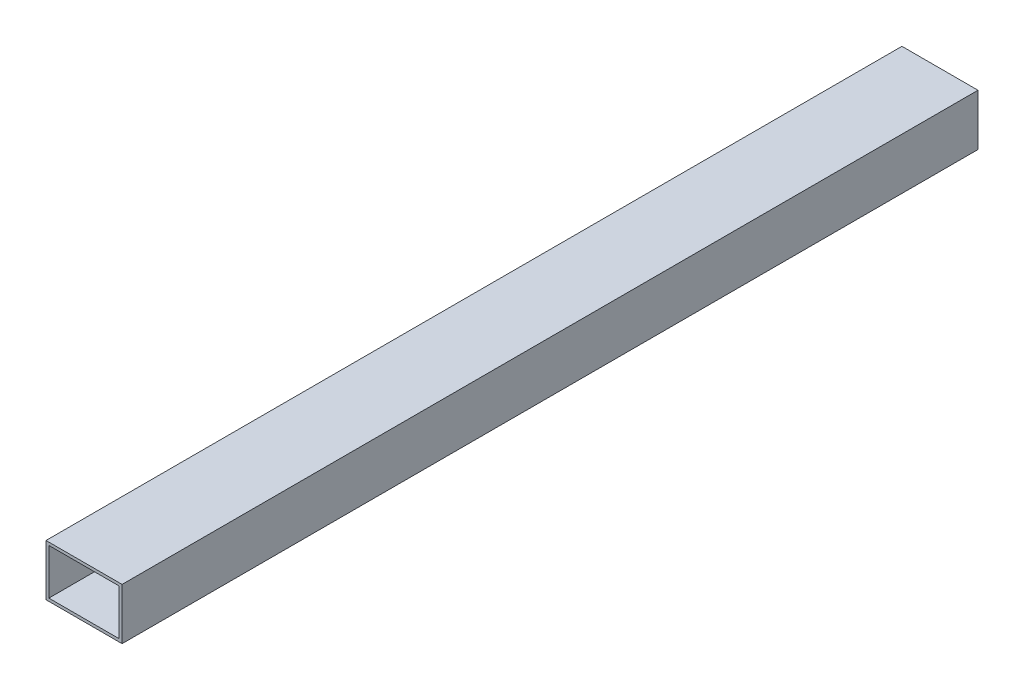
ISO-10303-21;
HEADER;
FILE_DESCRIPTION(('STEP AP214'),'2;1');
FILE_NAME('part.step','',(''),(''),'','','');
FILE_SCHEMA(('AUTOMOTIVE_DESIGN { 1 0 10303 214 1 1 1 1 }'));
ENDSEC;
DATA;
#1=APPLICATION_CONTEXT('core data for automotive mechanical design processes');
#2=APPLICATION_PROTOCOL_DEFINITION('international standard','automotive_design',2000,#1);
#3=PRODUCT_CONTEXT('',#1,'mechanical');
#4=PRODUCT('Part','Part','',(#3));
#5=PRODUCT_RELATED_PRODUCT_CATEGORY('part','',(#4));
#6=PRODUCT_DEFINITION_FORMATION('','',#4);
#7=PRODUCT_DEFINITION_CONTEXT('part definition',#1,'design');
#8=PRODUCT_DEFINITION('design','',#6,#7);
#9=PRODUCT_DEFINITION_SHAPE('','',#8);
#10=(LENGTH_UNIT() NAMED_UNIT(*) SI_UNIT(.MILLI.,.METRE.));
#11=(NAMED_UNIT(*) PLANE_ANGLE_UNIT() SI_UNIT($,.RADIAN.));
#12=(NAMED_UNIT(*) SI_UNIT($,.STERADIAN.) SOLID_ANGLE_UNIT());
#13=UNCERTAINTY_MEASURE_WITH_UNIT(LENGTH_MEASURE(1.E-05),#10,'distance_accuracy_value','');
#14=(GEOMETRIC_REPRESENTATION_CONTEXT(3) GLOBAL_UNCERTAINTY_ASSIGNED_CONTEXT((#13)) GLOBAL_UNIT_ASSIGNED_CONTEXT((#10,
#11,#12)) REPRESENTATION_CONTEXT('',''));
#15=CARTESIAN_POINT('',(0.,0.,0.));
#16=DIRECTION('',(0.,0.,1.));
#17=DIRECTION('',(1.,0.,0.));
#18=AXIS2_PLACEMENT_3D('',#15,#16,#17);
#19=CARTESIAN_POINT('',(0.,0.,450.));
#20=DIRECTION('',(0.,0.,-1.));
#21=DIRECTION('',(-1.,0.,0.));
#22=AXIS2_PLACEMENT_3D('',#19,#20,#21);
#23=PLANE('',#22);
#24=DIRECTION('',(0.,-1.,0.));
#25=VECTOR('',#24,1.);
#26=CARTESIAN_POINT('',(0.,0.,450.));
#27=LINE('',#26,#25);
#28=CARTESIAN_POINT('',(0.,27.,450.));
#29=VERTEX_POINT('',#28);
#30=CARTESIAN_POINT('',(0.,0.,450.));
#31=VERTEX_POINT('',#30);
#32=EDGE_CURVE('E134',#29,#31,#27,.T.);
#33=ORIENTED_EDGE('',*,*,#32,.T.);
#34=DIRECTION('',(1.,0.,0.));
#35=VECTOR('',#34,1.);
#36=CARTESIAN_POINT('',(0.,0.,450.));
#37=LINE('',#36,#35);
#38=CARTESIAN_POINT('',(40.,0.,450.));
#39=VERTEX_POINT('',#38);
#40=EDGE_CURVE('E137',#31,#39,#37,.T.);
#41=ORIENTED_EDGE('',*,*,#40,.T.);
#42=DIRECTION('',(0.,1.,0.));
#43=VECTOR('',#42,1.);
#44=CARTESIAN_POINT('',(40.,0.,450.));
#45=LINE('',#44,#43);
#46=CARTESIAN_POINT('',(40.,27.,450.));
#47=VERTEX_POINT('',#46);
#48=EDGE_CURVE('E140',#39,#47,#45,.T.);
#49=ORIENTED_EDGE('',*,*,#48,.T.);
#50=DIRECTION('',(-1.,0.,0.));
#51=VECTOR('',#50,1.);
#52=CARTESIAN_POINT('',(0.,27.,450.));
#53=LINE('',#52,#51);
#54=EDGE_CURVE('E142',#47,#29,#53,.T.);
#55=ORIENTED_EDGE('',*,*,#54,.T.);
#56=EDGE_LOOP('',(#33,#41,#49,#55));
#57=FACE_BOUND('',#56,.T.);
#58=DIRECTION('',(0.,-1.,0.));
#59=VECTOR('',#58,1.);
#60=CARTESIAN_POINT('',(1.5,25.5,450.));
#61=LINE('',#60,#59);
#62=CARTESIAN_POINT('',(1.5,25.5,450.));
#63=VERTEX_POINT('',#62);
#64=CARTESIAN_POINT('',(1.5,1.5,450.));
#65=VERTEX_POINT('',#64);
#66=EDGE_CURVE('E98',#63,#65,#61,.T.);
#67=ORIENTED_EDGE('',*,*,#66,.F.);
#68=DIRECTION('',(-1.,0.,0.));
#69=VECTOR('',#68,1.);
#70=CARTESIAN_POINT('',(1.5,25.5,450.));
#71=LINE('',#70,#69);
#72=CARTESIAN_POINT('',(38.5,25.5,450.));
#73=VERTEX_POINT('',#72);
#74=EDGE_CURVE('E120',#73,#63,#71,.T.);
#75=ORIENTED_EDGE('',*,*,#74,.F.);
#76=DIRECTION('',(0.,1.,0.));
#77=VECTOR('',#76,1.);
#78=CARTESIAN_POINT('',(38.5,25.5,450.));
#79=LINE('',#78,#77);
#80=CARTESIAN_POINT('',(38.5,1.5,450.));
#81=VERTEX_POINT('',#80);
#82=EDGE_CURVE('E118',#81,#73,#79,.T.);
#83=ORIENTED_EDGE('',*,*,#82,.F.);
#84=DIRECTION('',(1.,0.,0.));
#85=VECTOR('',#84,1.);
#86=CARTESIAN_POINT('',(1.5,1.5,450.));
#87=LINE('',#86,#85);
#88=EDGE_CURVE('E106',#65,#81,#87,.T.);
#89=ORIENTED_EDGE('',*,*,#88,.F.);
#90=EDGE_LOOP('',(#67,#75,#83,#89));
#91=FACE_BOUND('',#90,.T.);
#92=ADVANCED_FACE('F33',(#57,#91),#23,.F.);
#93=CARTESIAN_POINT('',(0.,0.,0.));
#94=DIRECTION('',(0.,0.,-1.));
#95=DIRECTION('',(-1.,0.,0.));
#96=AXIS2_PLACEMENT_3D('',#93,#94,#95);
#97=PLANE('',#96);
#98=DIRECTION('',(0.,-1.,0.));
#99=VECTOR('',#98,1.);
#100=CARTESIAN_POINT('',(0.,0.,0.));
#101=LINE('',#100,#99);
#102=CARTESIAN_POINT('',(0.,27.,0.));
#103=VERTEX_POINT('',#102);
#104=CARTESIAN_POINT('',(0.,0.,0.));
#105=VERTEX_POINT('',#104);
#106=EDGE_CURVE('E114',#103,#105,#101,.T.);
#107=ORIENTED_EDGE('',*,*,#106,.F.);
#108=DIRECTION('',(-1.,0.,0.));
#109=VECTOR('',#108,1.);
#110=CARTESIAN_POINT('',(0.,27.,0.));
#111=LINE('',#110,#109);
#112=CARTESIAN_POINT('',(40.,27.,0.));
#113=VERTEX_POINT('',#112);
#114=EDGE_CURVE('E138',#113,#103,#111,.T.);
#115=ORIENTED_EDGE('',*,*,#114,.F.);
#116=DIRECTION('',(0.,1.,0.));
#117=VECTOR('',#116,1.);
#118=CARTESIAN_POINT('',(40.,0.,0.));
#119=LINE('',#118,#117);
#120=CARTESIAN_POINT('',(40.,0.,0.));
#121=VERTEX_POINT('',#120);
#122=EDGE_CURVE('E149',#121,#113,#119,.T.);
#123=ORIENTED_EDGE('',*,*,#122,.F.);
#124=DIRECTION('',(1.,0.,0.));
#125=VECTOR('',#124,1.);
#126=CARTESIAN_POINT('',(0.,0.,0.));
#127=LINE('',#126,#125);
#128=EDGE_CURVE('E147',#105,#121,#127,.T.);
#129=ORIENTED_EDGE('',*,*,#128,.F.);
#130=EDGE_LOOP('',(#107,#115,#123,#129));
#131=FACE_BOUND('',#130,.T.);
#132=DIRECTION('',(-1.,0.,0.));
#133=VECTOR('',#132,1.);
#134=CARTESIAN_POINT('',(1.5,25.5,0.));
#135=LINE('',#134,#133);
#136=CARTESIAN_POINT('',(38.5,25.5,0.));
#137=VERTEX_POINT('',#136);
#138=CARTESIAN_POINT('',(1.5,25.5,0.));
#139=VERTEX_POINT('',#138);
#140=EDGE_CURVE('E107',#137,#139,#135,.T.);
#141=ORIENTED_EDGE('',*,*,#140,.T.);
#142=DIRECTION('',(0.,-1.,0.));
#143=VECTOR('',#142,1.);
#144=CARTESIAN_POINT('',(1.5,25.5,0.));
#145=LINE('',#144,#143);
#146=CARTESIAN_POINT('',(1.5,1.5,0.));
#147=VERTEX_POINT('',#146);
#148=EDGE_CURVE('E56',#139,#147,#145,.T.);
#149=ORIENTED_EDGE('',*,*,#148,.T.);
#150=DIRECTION('',(1.,0.,0.));
#151=VECTOR('',#150,1.);
#152=CARTESIAN_POINT('',(1.5,1.5,0.));
#153=LINE('',#152,#151);
#154=CARTESIAN_POINT('',(38.5,1.5,0.));
#155=VERTEX_POINT('',#154);
#156=EDGE_CURVE('E113',#147,#155,#153,.T.);
#157=ORIENTED_EDGE('',*,*,#156,.T.);
#158=DIRECTION('',(0.,1.,0.));
#159=VECTOR('',#158,1.);
#160=CARTESIAN_POINT('',(38.5,25.5,0.));
#161=LINE('',#160,#159);
#162=EDGE_CURVE('E126',#155,#137,#161,.T.);
#163=ORIENTED_EDGE('',*,*,#162,.T.);
#164=EDGE_LOOP('',(#141,#149,#157,#163));
#165=FACE_BOUND('',#164,.T.);
#166=ADVANCED_FACE('F167',(#131,#165),#97,.T.);
#167=CARTESIAN_POINT('',(0.,0.,450.));
#168=DIRECTION('',(1.,0.,0.));
#169=DIRECTION('',(0.,1.,0.));
#170=AXIS2_PLACEMENT_3D('',#167,#168,#169);
#171=PLANE('',#170);
#172=ORIENTED_EDGE('',*,*,#106,.T.);
#173=DIRECTION('',(0.,0.,-1.));
#174=VECTOR('',#173,1.);
#175=CARTESIAN_POINT('',(0.,0.,450.));
#176=LINE('',#175,#174);
#177=EDGE_CURVE('E11',#31,#105,#176,.T.);
#178=ORIENTED_EDGE('',*,*,#177,.F.);
#179=ORIENTED_EDGE('',*,*,#32,.F.);
#180=DIRECTION('',(0.,0.,-1.));
#181=VECTOR('',#180,1.);
#182=CARTESIAN_POINT('',(0.,27.,450.));
#183=LINE('',#182,#181);
#184=EDGE_CURVE('E144',#29,#103,#183,.T.);
#185=ORIENTED_EDGE('',*,*,#184,.T.);
#186=EDGE_LOOP('',(#172,#178,#179,#185));
#187=FACE_BOUND('',#186,.T.);
#188=ADVANCED_FACE('F35',(#187),#171,.F.);
#189=CARTESIAN_POINT('',(0.,0.,450.));
#190=DIRECTION('',(0.,1.,0.));
#191=DIRECTION('',(0.,0.,1.));
#192=AXIS2_PLACEMENT_3D('',#189,#190,#191);
#193=PLANE('',#192);
#194=ORIENTED_EDGE('',*,*,#128,.T.);
#195=DIRECTION('',(0.,0.,-1.));
#196=VECTOR('',#195,1.);
#197=CARTESIAN_POINT('',(40.,0.,450.));
#198=LINE('',#197,#196);
#199=EDGE_CURVE('E41',#39,#121,#198,.T.);
#200=ORIENTED_EDGE('',*,*,#199,.F.);
#201=ORIENTED_EDGE('',*,*,#40,.F.);
#202=ORIENTED_EDGE('',*,*,#177,.T.);
#203=EDGE_LOOP('',(#194,#200,#201,#202));
#204=FACE_BOUND('',#203,.T.);
#205=ADVANCED_FACE('F177',(#204),#193,.F.);
#206=CARTESIAN_POINT('',(40.,0.,450.));
#207=DIRECTION('',(-1.,0.,0.));
#208=DIRECTION('',(0.,-1.,0.));
#209=AXIS2_PLACEMENT_3D('',#206,#207,#208);
#210=PLANE('',#209);
#211=ORIENTED_EDGE('',*,*,#122,.T.);
#212=DIRECTION('',(0.,0.,-1.));
#213=VECTOR('',#212,1.);
#214=CARTESIAN_POINT('',(40.,27.,450.));
#215=LINE('',#214,#213);
#216=EDGE_CURVE('E154',#47,#113,#215,.T.);
#217=ORIENTED_EDGE('',*,*,#216,.F.);
#218=ORIENTED_EDGE('',*,*,#48,.F.);
#219=ORIENTED_EDGE('',*,*,#199,.T.);
#220=EDGE_LOOP('',(#211,#217,#218,#219));
#221=FACE_BOUND('',#220,.T.);
#222=ADVANCED_FACE('F161',(#221),#210,.F.);
#223=CARTESIAN_POINT('',(0.,27.,450.));
#224=DIRECTION('',(0.,-1.,0.));
#225=DIRECTION('',(0.,0.,-1.));
#226=AXIS2_PLACEMENT_3D('',#223,#224,#225);
#227=PLANE('',#226);
#228=ORIENTED_EDGE('',*,*,#114,.T.);
#229=ORIENTED_EDGE('',*,*,#184,.F.);
#230=ORIENTED_EDGE('',*,*,#54,.F.);
#231=ORIENTED_EDGE('',*,*,#216,.T.);
#232=EDGE_LOOP('',(#228,#229,#230,#231));
#233=FACE_BOUND('',#232,.T.);
#234=ADVANCED_FACE('F171',(#233),#227,.F.);
#235=CARTESIAN_POINT('',(1.5,25.5,450.));
#236=DIRECTION('',(1.,0.,0.));
#237=DIRECTION('',(0.,1.,0.));
#238=AXIS2_PLACEMENT_3D('',#235,#236,#237);
#239=PLANE('',#238);
#240=ORIENTED_EDGE('',*,*,#148,.F.);
#241=DIRECTION('',(0.,0.,-1.));
#242=VECTOR('',#241,1.);
#243=CARTESIAN_POINT('',(1.5,25.5,450.));
#244=LINE('',#243,#242);
#245=EDGE_CURVE('E102',#63,#139,#244,.T.);
#246=ORIENTED_EDGE('',*,*,#245,.F.);
#247=ORIENTED_EDGE('',*,*,#66,.T.);
#248=DIRECTION('',(0.,0.,-1.));
#249=VECTOR('',#248,1.);
#250=CARTESIAN_POINT('',(1.5,1.5,450.));
#251=LINE('',#250,#249);
#252=EDGE_CURVE('E101',#65,#147,#251,.T.);
#253=ORIENTED_EDGE('',*,*,#252,.T.);
#254=EDGE_LOOP('',(#240,#246,#247,#253));
#255=FACE_BOUND('',#254,.T.);
#256=ADVANCED_FACE('F100',(#255),#239,.T.);
#257=CARTESIAN_POINT('',(1.5,1.5,450.));
#258=DIRECTION('',(0.,1.,0.));
#259=DIRECTION('',(0.,0.,1.));
#260=AXIS2_PLACEMENT_3D('',#257,#258,#259);
#261=PLANE('',#260);
#262=ORIENTED_EDGE('',*,*,#156,.F.);
#263=ORIENTED_EDGE('',*,*,#252,.F.);
#264=ORIENTED_EDGE('',*,*,#88,.T.);
#265=DIRECTION('',(0.,0.,-1.));
#266=VECTOR('',#265,1.);
#267=CARTESIAN_POINT('',(38.5,1.5,450.));
#268=LINE('',#267,#266);
#269=EDGE_CURVE('E115',#81,#155,#268,.T.);
#270=ORIENTED_EDGE('',*,*,#269,.T.);
#271=EDGE_LOOP('',(#262,#263,#264,#270));
#272=FACE_BOUND('',#271,.T.);
#273=ADVANCED_FACE('F110',(#272),#261,.T.);
#274=CARTESIAN_POINT('',(38.5,25.5,450.));
#275=DIRECTION('',(-1.,0.,0.));
#276=DIRECTION('',(0.,-1.,0.));
#277=AXIS2_PLACEMENT_3D('',#274,#275,#276);
#278=PLANE('',#277);
#279=ORIENTED_EDGE('',*,*,#162,.F.);
#280=ORIENTED_EDGE('',*,*,#269,.F.);
#281=ORIENTED_EDGE('',*,*,#82,.T.);
#282=DIRECTION('',(0.,0.,-1.));
#283=VECTOR('',#282,1.);
#284=CARTESIAN_POINT('',(38.5,25.5,450.));
#285=LINE('',#284,#283);
#286=EDGE_CURVE('E48',#73,#137,#285,.T.);
#287=ORIENTED_EDGE('',*,*,#286,.T.);
#288=EDGE_LOOP('',(#279,#280,#281,#287));
#289=FACE_BOUND('',#288,.T.);
#290=ADVANCED_FACE('F200',(#289),#278,.T.);
#291=CARTESIAN_POINT('',(1.5,25.5,450.));
#292=DIRECTION('',(0.,-1.,0.));
#293=DIRECTION('',(0.,0.,-1.));
#294=AXIS2_PLACEMENT_3D('',#291,#292,#293);
#295=PLANE('',#294);
#296=ORIENTED_EDGE('',*,*,#140,.F.);
#297=ORIENTED_EDGE('',*,*,#286,.F.);
#298=ORIENTED_EDGE('',*,*,#74,.T.);
#299=ORIENTED_EDGE('',*,*,#245,.T.);
#300=EDGE_LOOP('',(#296,#297,#298,#299));
#301=FACE_BOUND('',#300,.T.);
#302=ADVANCED_FACE('F204',(#301),#295,.T.);
#303=CLOSED_SHELL('',(#92,#166,#188,#205,#222,#234,#256,#273,#290,#302));
#304=MANIFOLD_SOLID_BREP('B2',#303);
#305=ADVANCED_BREP_SHAPE_REPRESENTATION('',(#18,#304),#14);
#306=SHAPE_DEFINITION_REPRESENTATION(#9,#305);
ENDSEC;
END-ISO-10303-21;
